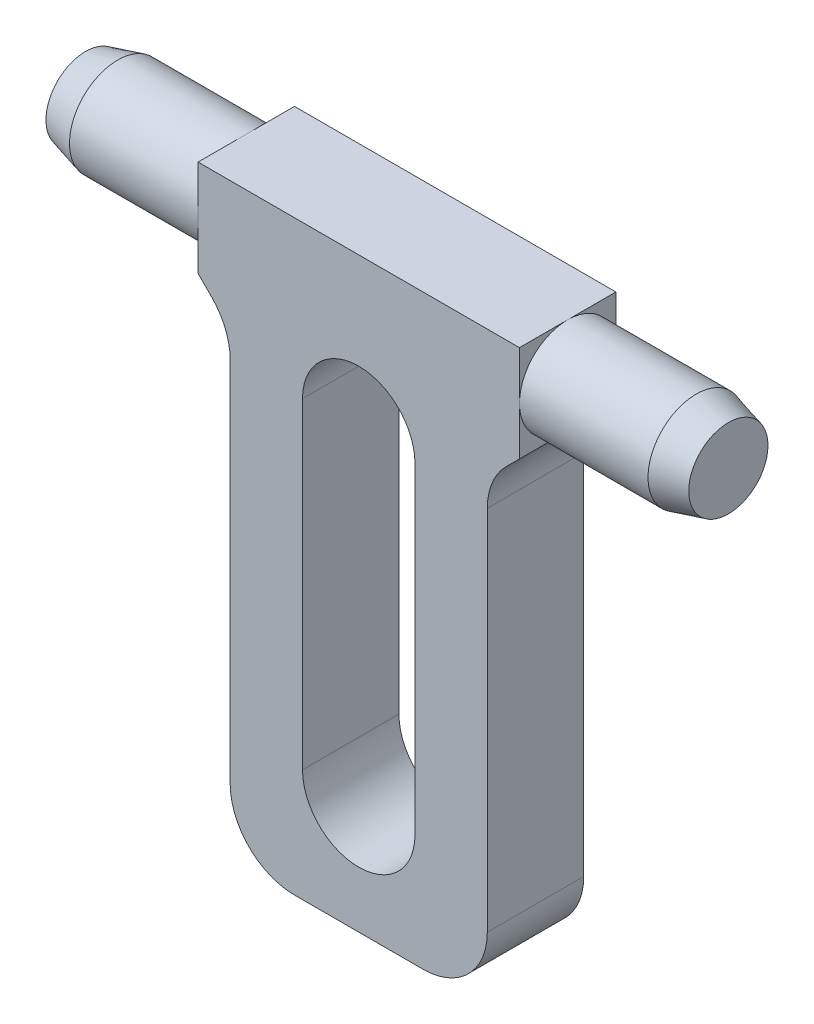
ISO-10303-21;
HEADER;
FILE_DESCRIPTION(('STEP AP214'),'2;1');
FILE_NAME('part.step','',(''),(''),'','','');
FILE_SCHEMA(('AUTOMOTIVE_DESIGN { 1 0 10303 214 1 1 1 1 }'));
ENDSEC;
DATA;
#1=APPLICATION_CONTEXT('core data for automotive mechanical design processes');
#2=APPLICATION_PROTOCOL_DEFINITION('international standard','automotive_design',2000,#1);
#3=PRODUCT_CONTEXT('',#1,'mechanical');
#4=PRODUCT('Part','Part','',(#3));
#5=PRODUCT_RELATED_PRODUCT_CATEGORY('part','',(#4));
#6=PRODUCT_DEFINITION_FORMATION('','',#4);
#7=PRODUCT_DEFINITION_CONTEXT('part definition',#1,'design');
#8=PRODUCT_DEFINITION('design','',#6,#7);
#9=PRODUCT_DEFINITION_SHAPE('','',#8);
#10=(LENGTH_UNIT() NAMED_UNIT(*) SI_UNIT(.MILLI.,.METRE.));
#11=(NAMED_UNIT(*) PLANE_ANGLE_UNIT() SI_UNIT($,.RADIAN.));
#12=(NAMED_UNIT(*) SI_UNIT($,.STERADIAN.) SOLID_ANGLE_UNIT());
#13=UNCERTAINTY_MEASURE_WITH_UNIT(LENGTH_MEASURE(1.E-05),#10,'distance_accuracy_value','');
#14=(GEOMETRIC_REPRESENTATION_CONTEXT(3) GLOBAL_UNCERTAINTY_ASSIGNED_CONTEXT((#13)) GLOBAL_UNIT_ASSIGNED_CONTEXT((#10,
#11,#12)) REPRESENTATION_CONTEXT('',''));
#15=CARTESIAN_POINT('',(0.,0.,0.));
#16=DIRECTION('',(0.,0.,1.));
#17=DIRECTION('',(1.,0.,0.));
#18=AXIS2_PLACEMENT_3D('',#15,#16,#17);
#19=CARTESIAN_POINT('',(5.,1.5,1.5));
#20=DIRECTION('',(-1.,0.,0.));
#21=DIRECTION('',(0.,0.,1.));
#22=AXIS2_PLACEMENT_3D('',#19,#20,#21);
#23=PLANE('',#22);
#24=CARTESIAN_POINT('',(5.,0.,0.));
#25=DIRECTION('',(-1.,0.,0.));
#26=DIRECTION('',(0.,0.,1.));
#27=AXIS2_PLACEMENT_3D('',#24,#25,#26);
#28=CIRCLE('',#27,1.5);
#29=CARTESIAN_POINT('',(5.,0.,1.5));
#30=VERTEX_POINT('',#29);
#31=CARTESIAN_POINT('',(5.,-1.5,0.));
#32=VERTEX_POINT('',#31);
#33=EDGE_CURVE('E342',#30,#32,#28,.F.);
#34=ORIENTED_EDGE('',*,*,#33,.F.);
#35=DIRECTION('',(0.,1.,0.));
#36=VECTOR('',#35,1.);
#37=CARTESIAN_POINT('',(5.,1.5,1.5));
#38=LINE('',#37,#36);
#39=CARTESIAN_POINT('',(5.,-1.5,1.5));
#40=VERTEX_POINT('',#39);
#41=EDGE_CURVE('E252',#40,#30,#38,.T.);
#42=ORIENTED_EDGE('',*,*,#41,.F.);
#43=DIRECTION('',(0.,0.,-1.));
#44=VECTOR('',#43,1.);
#45=CARTESIAN_POINT('',(5.,-1.5,1.5));
#46=LINE('',#45,#44);
#47=EDGE_CURVE('E11',#40,#32,#46,.T.);
#48=ORIENTED_EDGE('',*,*,#47,.T.);
#49=EDGE_LOOP('',(#34,#42,#48));
#50=FACE_BOUND('',#49,.T.);
#51=ADVANCED_FACE('F33',(#50),#23,.F.);
#52=CARTESIAN_POINT('',(5.,0.,-1.5));
#53=VERTEX_POINT('',#52);
#54=EDGE_CURVE('E51',#32,#53,#28,.F.);
#55=ORIENTED_EDGE('',*,*,#54,.F.);
#56=CARTESIAN_POINT('',(5.,-1.5,-1.5));
#57=VERTEX_POINT('',#56);
#58=EDGE_CURVE('E41',#32,#57,#46,.T.);
#59=ORIENTED_EDGE('',*,*,#58,.T.);
#60=DIRECTION('',(0.,1.,0.));
#61=VECTOR('',#60,1.);
#62=CARTESIAN_POINT('',(5.,1.5,-1.5));
#63=LINE('',#62,#61);
#64=EDGE_CURVE('E280',#57,#53,#63,.T.);
#65=ORIENTED_EDGE('',*,*,#64,.T.);
#66=EDGE_LOOP('',(#55,#59,#65));
#67=FACE_BOUND('',#66,.T.);
#68=ADVANCED_FACE('F336',(#67),#23,.F.);
#69=CARTESIAN_POINT('',(5.,1.5,0.));
#70=VERTEX_POINT('',#69);
#71=EDGE_CURVE('E200',#53,#70,#28,.F.);
#72=ORIENTED_EDGE('',*,*,#71,.F.);
#73=CARTESIAN_POINT('',(5.,1.5,-1.5));
#74=VERTEX_POINT('',#73);
#75=EDGE_CURVE('E279',#53,#74,#63,.T.);
#76=ORIENTED_EDGE('',*,*,#75,.T.);
#77=DIRECTION('',(0.,0.,-1.));
#78=VECTOR('',#77,1.);
#79=CARTESIAN_POINT('',(5.,1.5,1.5));
#80=LINE('',#79,#78);
#81=EDGE_CURVE('E324',#70,#74,#80,.T.);
#82=ORIENTED_EDGE('',*,*,#81,.F.);
#83=EDGE_LOOP('',(#72,#76,#82));
#84=FACE_BOUND('',#83,.T.);
#85=ADVANCED_FACE('F411',(#84),#23,.F.);
#86=EDGE_CURVE('E214',#70,#30,#28,.F.);
#87=ORIENTED_EDGE('',*,*,#86,.F.);
#88=CARTESIAN_POINT('',(5.,1.5,1.5));
#89=VERTEX_POINT('',#88);
#90=EDGE_CURVE('E325',#89,#70,#80,.T.);
#91=ORIENTED_EDGE('',*,*,#90,.F.);
#92=EDGE_CURVE('E250',#30,#89,#38,.T.);
#93=ORIENTED_EDGE('',*,*,#92,.F.);
#94=EDGE_LOOP('',(#87,#91,#93));
#95=FACE_BOUND('',#94,.T.);
#96=ADVANCED_FACE('F345',(#95),#23,.F.);
#97=CARTESIAN_POINT('',(-5.,1.5,1.5));
#98=DIRECTION('',(1.,0.,0.));
#99=DIRECTION('',(0.,0.,-1.));
#100=AXIS2_PLACEMENT_3D('',#97,#98,#99);
#101=PLANE('',#100);
#102=CARTESIAN_POINT('',(-5.,0.,0.));
#103=DIRECTION('',(1.,0.,0.));
#104=DIRECTION('',(0.,0.,-1.));
#105=AXIS2_PLACEMENT_3D('',#102,#103,#104);
#106=CIRCLE('',#105,1.5);
#107=CARTESIAN_POINT('',(-5.,0.,-1.5));
#108=VERTEX_POINT('',#107);
#109=CARTESIAN_POINT('',(-5.,-1.5,0.));
#110=VERTEX_POINT('',#109);
#111=EDGE_CURVE('E194',#108,#110,#106,.F.);
#112=ORIENTED_EDGE('',*,*,#111,.F.);
#113=DIRECTION('',(0.,-1.,0.));
#114=VECTOR('',#113,1.);
#115=CARTESIAN_POINT('',(-5.,1.5,-1.5));
#116=LINE('',#115,#114);
#117=CARTESIAN_POINT('',(-5.,-1.5,-1.5));
#118=VERTEX_POINT('',#117);
#119=EDGE_CURVE('E181',#108,#118,#116,.T.);
#120=ORIENTED_EDGE('',*,*,#119,.T.);
#121=DIRECTION('',(0.,0.,-1.));
#122=VECTOR('',#121,1.);
#123=CARTESIAN_POINT('',(-5.,-1.5,1.5));
#124=LINE('',#123,#122);
#125=EDGE_CURVE('E196',#110,#118,#124,.T.);
#126=ORIENTED_EDGE('',*,*,#125,.F.);
#127=EDGE_LOOP('',(#112,#120,#126));
#128=FACE_BOUND('',#127,.T.);
#129=ADVANCED_FACE('F195',(#128),#101,.F.);
#130=CARTESIAN_POINT('',(-5.,0.,1.5));
#131=VERTEX_POINT('',#130);
#132=EDGE_CURVE('E201',#110,#131,#106,.F.);
#133=ORIENTED_EDGE('',*,*,#132,.F.);
#134=CARTESIAN_POINT('',(-5.,-1.5,1.5));
#135=VERTEX_POINT('',#134);
#136=EDGE_CURVE('E320',#135,#110,#124,.T.);
#137=ORIENTED_EDGE('',*,*,#136,.F.);
#138=DIRECTION('',(0.,-1.,0.));
#139=VECTOR('',#138,1.);
#140=CARTESIAN_POINT('',(-5.,1.5,1.5));
#141=LINE('',#140,#139);
#142=EDGE_CURVE('E256',#131,#135,#141,.T.);
#143=ORIENTED_EDGE('',*,*,#142,.F.);
#144=EDGE_LOOP('',(#133,#137,#143));
#145=FACE_BOUND('',#144,.T.);
#146=ADVANCED_FACE('F392',(#145),#101,.F.);
#147=CARTESIAN_POINT('',(-5.,1.5,0.));
#148=VERTEX_POINT('',#147);
#149=EDGE_CURVE('E205',#131,#148,#106,.F.);
#150=ORIENTED_EDGE('',*,*,#149,.F.);
#151=CARTESIAN_POINT('',(-5.,1.5,1.5));
#152=VERTEX_POINT('',#151);
#153=EDGE_CURVE('E257',#152,#131,#141,.T.);
#154=ORIENTED_EDGE('',*,*,#153,.F.);
#155=DIRECTION('',(0.,0.,-1.));
#156=VECTOR('',#155,1.);
#157=CARTESIAN_POINT('',(-5.,1.5,1.5));
#158=LINE('',#157,#156);
#159=EDGE_CURVE('E322',#152,#148,#158,.T.);
#160=ORIENTED_EDGE('',*,*,#159,.T.);
#161=EDGE_LOOP('',(#150,#154,#160));
#162=FACE_BOUND('',#161,.T.);
#163=ADVANCED_FACE('F398',(#162),#101,.F.);
#164=EDGE_CURVE('E174',#148,#108,#106,.F.);
#165=ORIENTED_EDGE('',*,*,#164,.F.);
#166=CARTESIAN_POINT('',(-5.,1.5,-1.5));
#167=VERTEX_POINT('',#166);
#168=EDGE_CURVE('E176',#148,#167,#158,.T.);
#169=ORIENTED_EDGE('',*,*,#168,.T.);
#170=EDGE_CURVE('E170',#167,#108,#116,.T.);
#171=ORIENTED_EDGE('',*,*,#170,.T.);
#172=EDGE_LOOP('',(#165,#169,#171));
#173=FACE_BOUND('',#172,.T.);
#174=ADVANCED_FACE('F172',(#173),#101,.F.);
#175=CARTESIAN_POINT('',(-6.,-3.32842712474619,1.5));
#176=DIRECTION('',(0.,0.,-1.));
#177=DIRECTION('',(-1.,0.,0.));
#178=AXIS2_PLACEMENT_3D('',#175,#176,#177);
#179=PLANE('',#178);
#180=ORIENTED_EDGE('',*,*,#153,.T.);
#181=ORIENTED_EDGE('',*,*,#142,.T.);
#182=DIRECTION('',(0.707106781186547,-0.707106781186547,0.));
#183=VECTOR('',#182,1.);
#184=CARTESIAN_POINT('',(-5.,-1.5,1.5));
#185=LINE('',#184,#183);
#186=CARTESIAN_POINT('',(-4.58578643762691,-1.9142135623731,1.5));
#187=VERTEX_POINT('',#186);
#188=EDGE_CURVE('E260',#135,#187,#185,.T.);
#189=ORIENTED_EDGE('',*,*,#188,.T.);
#190=CARTESIAN_POINT('',(-6.,-3.32842712474619,1.5));
#191=DIRECTION('',(0.,0.,-1.));
#192=DIRECTION('',(-1.,0.,0.));
#193=AXIS2_PLACEMENT_3D('',#190,#191,#192);
#194=CIRCLE('',#193,2.);
#195=CARTESIAN_POINT('',(-4.,-3.32842712474619,1.5));
#196=VERTEX_POINT('',#195);
#197=EDGE_CURVE('E262',#187,#196,#194,.T.);
#198=ORIENTED_EDGE('',*,*,#197,.T.);
#199=DIRECTION('',(0.,-1.,0.));
#200=VECTOR('',#199,1.);
#201=CARTESIAN_POINT('',(-4.,-3.32842712474619,1.5));
#202=LINE('',#201,#200);
#203=CARTESIAN_POINT('',(-4.,-14.75,1.5));
#204=VERTEX_POINT('',#203);
#205=EDGE_CURVE('E264',#196,#204,#202,.T.);
#206=ORIENTED_EDGE('',*,*,#205,.T.);
#207=CARTESIAN_POINT('',(-2.,-14.75,1.5));
#208=DIRECTION('',(0.,0.,1.));
#209=DIRECTION('',(1.,0.,0.));
#210=AXIS2_PLACEMENT_3D('',#207,#208,#209);
#211=CIRCLE('',#210,2.);
#212=CARTESIAN_POINT('',(-2.,-16.75,1.5));
#213=VERTEX_POINT('',#212);
#214=EDGE_CURVE('E266',#204,#213,#211,.T.);
#215=ORIENTED_EDGE('',*,*,#214,.T.);
#216=DIRECTION('',(1.,0.,0.));
#217=VECTOR('',#216,1.);
#218=CARTESIAN_POINT('',(-2.,-16.75,1.5));
#219=LINE('',#218,#217);
#220=CARTESIAN_POINT('',(2.,-16.75,1.5));
#221=VERTEX_POINT('',#220);
#222=EDGE_CURVE('E268',#213,#221,#219,.T.);
#223=ORIENTED_EDGE('',*,*,#222,.T.);
#224=CARTESIAN_POINT('',(2.,-14.75,1.5));
#225=DIRECTION('',(0.,0.,1.));
#226=DIRECTION('',(1.,0.,0.));
#227=AXIS2_PLACEMENT_3D('',#224,#225,#226);
#228=CIRCLE('',#227,2.);
#229=CARTESIAN_POINT('',(4.,-14.75,1.5));
#230=VERTEX_POINT('',#229);
#231=EDGE_CURVE('E270',#221,#230,#228,.T.);
#232=ORIENTED_EDGE('',*,*,#231,.T.);
#233=DIRECTION('',(0.,1.,0.));
#234=VECTOR('',#233,1.);
#235=CARTESIAN_POINT('',(4.,-14.75,1.5));
#236=LINE('',#235,#234);
#237=CARTESIAN_POINT('',(4.,-3.32842712474619,1.5));
#238=VERTEX_POINT('',#237);
#239=EDGE_CURVE('E272',#230,#238,#236,.T.);
#240=ORIENTED_EDGE('',*,*,#239,.T.);
#241=CARTESIAN_POINT('',(6.,-3.32842712474619,1.5));
#242=DIRECTION('',(0.,0.,-1.));
#243=DIRECTION('',(-1.,0.,0.));
#244=AXIS2_PLACEMENT_3D('',#241,#242,#243);
#245=CIRCLE('',#244,2.);
#246=CARTESIAN_POINT('',(4.58578643762691,-1.9142135623731,1.5));
#247=VERTEX_POINT('',#246);
#248=EDGE_CURVE('E274',#238,#247,#245,.T.);
#249=ORIENTED_EDGE('',*,*,#248,.T.);
#250=DIRECTION('',(0.707106781186547,0.707106781186548,0.));
#251=VECTOR('',#250,1.);
#252=CARTESIAN_POINT('',(4.58578643762691,-1.9142135623731,1.5));
#253=LINE('',#252,#251);
#254=EDGE_CURVE('E247',#247,#40,#253,.T.);
#255=ORIENTED_EDGE('',*,*,#254,.T.);
#256=ORIENTED_EDGE('',*,*,#41,.T.);
#257=ORIENTED_EDGE('',*,*,#92,.T.);
#258=DIRECTION('',(-1.,0.,0.));
#259=VECTOR('',#258,1.);
#260=CARTESIAN_POINT('',(-5.,1.5,1.5));
#261=LINE('',#260,#259);
#262=EDGE_CURVE('E254',#89,#152,#261,.T.);
#263=ORIENTED_EDGE('',*,*,#262,.T.);
#264=EDGE_LOOP('',(#180,#181,#189,#198,#206,#215,#223,#232,#240,#249,#255,#256,#257,#263));
#265=FACE_BOUND('',#264,.T.);
#266=CARTESIAN_POINT('',(0.,-3.25,1.5));
#267=DIRECTION('',(0.,0.,1.));
#268=DIRECTION('',(1.,0.,0.));
#269=AXIS2_PLACEMENT_3D('',#266,#267,#268);
#270=CIRCLE('',#269,1.75);
#271=CARTESIAN_POINT('',(1.75,-3.25,1.5));
#272=VERTEX_POINT('',#271);
#273=CARTESIAN_POINT('',(-1.75,-3.25,1.5));
#274=VERTEX_POINT('',#273);
#275=EDGE_CURVE('E215',#272,#274,#270,.T.);
#276=ORIENTED_EDGE('',*,*,#275,.F.);
#277=DIRECTION('',(0.,1.,0.));
#278=VECTOR('',#277,1.);
#279=CARTESIAN_POINT('',(1.75,-3.25,1.5));
#280=LINE('',#279,#278);
#281=CARTESIAN_POINT('',(1.75,-13.25,1.5));
#282=VERTEX_POINT('',#281);
#283=EDGE_CURVE('E223',#282,#272,#280,.T.);
#284=ORIENTED_EDGE('',*,*,#283,.F.);
#285=CARTESIAN_POINT('',(0.,-13.25,1.5));
#286=DIRECTION('',(0.,0.,1.));
#287=DIRECTION('',(1.,0.,0.));
#288=AXIS2_PLACEMENT_3D('',#285,#286,#287);
#289=CIRCLE('',#288,1.75);
#290=CARTESIAN_POINT('',(-1.75,-13.25,1.5));
#291=VERTEX_POINT('',#290);
#292=EDGE_CURVE('E220',#291,#282,#289,.T.);
#293=ORIENTED_EDGE('',*,*,#292,.F.);
#294=DIRECTION('',(0.,-1.,0.));
#295=VECTOR('',#294,1.);
#296=CARTESIAN_POINT('',(-1.75,-3.25,1.5));
#297=LINE('',#296,#295);
#298=EDGE_CURVE('E217',#274,#291,#297,.T.);
#299=ORIENTED_EDGE('',*,*,#298,.F.);
#300=EDGE_LOOP('',(#276,#284,#293,#299));
#301=FACE_BOUND('',#300,.T.);
#302=ADVANCED_FACE('F394',(#265,#301),#179,.F.);
#303=CARTESIAN_POINT('',(-6.,-3.32842712474619,-1.5));
#304=DIRECTION('',(0.,0.,-1.));
#305=DIRECTION('',(-1.,0.,0.));
#306=AXIS2_PLACEMENT_3D('',#303,#304,#305);
#307=PLANE('',#306);
#308=ORIENTED_EDGE('',*,*,#75,.F.);
#309=ORIENTED_EDGE('',*,*,#64,.F.);
#310=DIRECTION('',(0.707106781186547,0.707106781186548,0.));
#311=VECTOR('',#310,1.);
#312=CARTESIAN_POINT('',(4.58578643762691,-1.9142135623731,-1.5));
#313=LINE('',#312,#311);
#314=CARTESIAN_POINT('',(4.58578643762691,-1.9142135623731,-1.5));
#315=VERTEX_POINT('',#314);
#316=EDGE_CURVE('E246',#315,#57,#313,.T.);
#317=ORIENTED_EDGE('',*,*,#316,.F.);
#318=CARTESIAN_POINT('',(6.,-3.32842712474619,-1.5));
#319=DIRECTION('',(0.,0.,-1.));
#320=DIRECTION('',(-1.,0.,0.));
#321=AXIS2_PLACEMENT_3D('',#318,#319,#320);
#322=CIRCLE('',#321,2.);
#323=CARTESIAN_POINT('',(4.,-3.32842712474619,-1.5));
#324=VERTEX_POINT('',#323);
#325=EDGE_CURVE('E251',#324,#315,#322,.T.);
#326=ORIENTED_EDGE('',*,*,#325,.F.);
#327=DIRECTION('',(0.,1.,0.));
#328=VECTOR('',#327,1.);
#329=CARTESIAN_POINT('',(4.,-14.75,-1.5));
#330=LINE('',#329,#328);
#331=CARTESIAN_POINT('',(4.,-14.75,-1.5));
#332=VERTEX_POINT('',#331);
#333=EDGE_CURVE('E294',#332,#324,#330,.T.);
#334=ORIENTED_EDGE('',*,*,#333,.F.);
#335=CARTESIAN_POINT('',(2.,-14.75,-1.5));
#336=DIRECTION('',(0.,0.,1.));
#337=DIRECTION('',(1.,0.,0.));
#338=AXIS2_PLACEMENT_3D('',#335,#336,#337);
#339=CIRCLE('',#338,2.);
#340=CARTESIAN_POINT('',(2.,-16.75,-1.5));
#341=VERTEX_POINT('',#340);
#342=EDGE_CURVE('E292',#341,#332,#339,.T.);
#343=ORIENTED_EDGE('',*,*,#342,.F.);
#344=DIRECTION('',(1.,0.,0.));
#345=VECTOR('',#344,1.);
#346=CARTESIAN_POINT('',(-2.,-16.75,-1.5));
#347=LINE('',#346,#345);
#348=CARTESIAN_POINT('',(-2.,-16.75,-1.5));
#349=VERTEX_POINT('',#348);
#350=EDGE_CURVE('E290',#349,#341,#347,.T.);
#351=ORIENTED_EDGE('',*,*,#350,.F.);
#352=CARTESIAN_POINT('',(-2.,-14.75,-1.5));
#353=DIRECTION('',(0.,0.,1.));
#354=DIRECTION('',(1.,0.,0.));
#355=AXIS2_PLACEMENT_3D('',#352,#353,#354);
#356=CIRCLE('',#355,2.);
#357=CARTESIAN_POINT('',(-4.,-14.75,-1.5));
#358=VERTEX_POINT('',#357);
#359=EDGE_CURVE('E288',#358,#349,#356,.T.);
#360=ORIENTED_EDGE('',*,*,#359,.F.);
#361=DIRECTION('',(0.,-1.,0.));
#362=VECTOR('',#361,1.);
#363=CARTESIAN_POINT('',(-4.,-3.32842712474619,-1.5));
#364=LINE('',#363,#362);
#365=CARTESIAN_POINT('',(-4.,-3.32842712474619,-1.5));
#366=VERTEX_POINT('',#365);
#367=EDGE_CURVE('E286',#366,#358,#364,.T.);
#368=ORIENTED_EDGE('',*,*,#367,.F.);
#369=CARTESIAN_POINT('',(-6.,-3.32842712474619,-1.5));
#370=DIRECTION('',(0.,0.,-1.));
#371=DIRECTION('',(-1.,0.,0.));
#372=AXIS2_PLACEMENT_3D('',#369,#370,#371);
#373=CIRCLE('',#372,2.);
#374=CARTESIAN_POINT('',(-4.58578643762691,-1.9142135623731,-1.5));
#375=VERTEX_POINT('',#374);
#376=EDGE_CURVE('E284',#375,#366,#373,.T.);
#377=ORIENTED_EDGE('',*,*,#376,.F.);
#378=DIRECTION('',(0.707106781186547,-0.707106781186547,0.));
#379=VECTOR('',#378,1.);
#380=CARTESIAN_POINT('',(-5.,-1.5,-1.5));
#381=LINE('',#380,#379);
#382=EDGE_CURVE('E180',#118,#375,#381,.T.);
#383=ORIENTED_EDGE('',*,*,#382,.F.);
#384=ORIENTED_EDGE('',*,*,#119,.F.);
#385=ORIENTED_EDGE('',*,*,#170,.F.);
#386=DIRECTION('',(-1.,0.,0.));
#387=VECTOR('',#386,1.);
#388=CARTESIAN_POINT('',(-5.,1.5,-1.5));
#389=LINE('',#388,#387);
#390=EDGE_CURVE('E192',#74,#167,#389,.T.);
#391=ORIENTED_EDGE('',*,*,#390,.F.);
#392=EDGE_LOOP('',(#308,#309,#317,#326,#334,#343,#351,#360,#368,#377,#383,#384,#385,#391));
#393=FACE_BOUND('',#392,.T.);
#394=DIRECTION('',(0.,1.,0.));
#395=VECTOR('',#394,1.);
#396=CARTESIAN_POINT('',(1.75,-3.25,-1.5));
#397=LINE('',#396,#395);
#398=CARTESIAN_POINT('',(1.75,-13.25,-1.5));
#399=VERTEX_POINT('',#398);
#400=CARTESIAN_POINT('',(1.75,-3.25,-1.5));
#401=VERTEX_POINT('',#400);
#402=EDGE_CURVE('E218',#399,#401,#397,.T.);
#403=ORIENTED_EDGE('',*,*,#402,.T.);
#404=CARTESIAN_POINT('',(0.,-3.25,-1.5));
#405=DIRECTION('',(0.,0.,1.));
#406=DIRECTION('',(1.,0.,0.));
#407=AXIS2_PLACEMENT_3D('',#404,#405,#406);
#408=CIRCLE('',#407,1.75);
#409=CARTESIAN_POINT('',(-1.75,-3.25,-1.5));
#410=VERTEX_POINT('',#409);
#411=EDGE_CURVE('E226',#401,#410,#408,.T.);
#412=ORIENTED_EDGE('',*,*,#411,.T.);
#413=DIRECTION('',(0.,-1.,0.));
#414=VECTOR('',#413,1.);
#415=CARTESIAN_POINT('',(-1.75,-3.25,-1.5));
#416=LINE('',#415,#414);
#417=CARTESIAN_POINT('',(-1.75,-13.25,-1.5));
#418=VERTEX_POINT('',#417);
#419=EDGE_CURVE('E229',#410,#418,#416,.T.);
#420=ORIENTED_EDGE('',*,*,#419,.T.);
#421=CARTESIAN_POINT('',(0.,-13.25,-1.5));
#422=DIRECTION('',(0.,0.,1.));
#423=DIRECTION('',(1.,0.,0.));
#424=AXIS2_PLACEMENT_3D('',#421,#422,#423);
#425=CIRCLE('',#424,1.75);
#426=EDGE_CURVE('E232',#418,#399,#425,.T.);
#427=ORIENTED_EDGE('',*,*,#426,.T.);
#428=EDGE_LOOP('',(#403,#412,#420,#427));
#429=FACE_BOUND('',#428,.T.);
#430=ADVANCED_FACE('F186',(#393,#429),#307,.T.);
#431=CARTESIAN_POINT('',(4.58578643762691,-1.9142135623731,1.5));
#432=DIRECTION('',(-0.707106781186548,0.707106781186547,0.));
#433=DIRECTION('',(-0.707106781186547,-0.707106781186548,0.));
#434=AXIS2_PLACEMENT_3D('',#431,#432,#433);
#435=PLANE('',#434);
#436=ORIENTED_EDGE('',*,*,#316,.T.);
#437=ORIENTED_EDGE('',*,*,#58,.F.);
#438=ORIENTED_EDGE('',*,*,#47,.F.);
#439=ORIENTED_EDGE('',*,*,#254,.F.);
#440=DIRECTION('',(0.,0.,-1.));
#441=VECTOR('',#440,1.);
#442=CARTESIAN_POINT('',(4.58578643762691,-1.9142135623731,1.5));
#443=LINE('',#442,#441);
#444=EDGE_CURVE('E276',#247,#315,#443,.T.);
#445=ORIENTED_EDGE('',*,*,#444,.T.);
#446=EDGE_LOOP('',(#436,#437,#438,#439,#445));
#447=FACE_BOUND('',#446,.T.);
#448=ADVANCED_FACE('F35',(#447),#435,.F.);
#449=CARTESIAN_POINT('',(-5.,1.5,1.5));
#450=DIRECTION('',(0.,-1.,0.));
#451=DIRECTION('',(0.,0.,-1.));
#452=AXIS2_PLACEMENT_3D('',#449,#450,#451);
#453=PLANE('',#452);
#454=ORIENTED_EDGE('',*,*,#168,.F.);
#455=ORIENTED_EDGE('',*,*,#159,.F.);
#456=ORIENTED_EDGE('',*,*,#262,.F.);
#457=ORIENTED_EDGE('',*,*,#90,.T.);
#458=ORIENTED_EDGE('',*,*,#81,.T.);
#459=ORIENTED_EDGE('',*,*,#390,.T.);
#460=EDGE_LOOP('',(#454,#455,#456,#457,#458,#459));
#461=FACE_BOUND('',#460,.T.);
#462=ADVANCED_FACE('F332',(#461),#453,.F.);
#463=CARTESIAN_POINT('',(-5.,-1.5,1.5));
#464=DIRECTION('',(0.707106781186548,0.707106781186548,0.));
#465=DIRECTION('',(-0.707106781186548,0.707106781186548,0.));
#466=AXIS2_PLACEMENT_3D('',#463,#464,#465);
#467=PLANE('',#466);
#468=ORIENTED_EDGE('',*,*,#382,.T.);
#469=DIRECTION('',(0.,0.,-1.));
#470=VECTOR('',#469,1.);
#471=CARTESIAN_POINT('',(-4.58578643762691,-1.9142135623731,1.5));
#472=LINE('',#471,#470);
#473=EDGE_CURVE('E317',#187,#375,#472,.T.);
#474=ORIENTED_EDGE('',*,*,#473,.F.);
#475=ORIENTED_EDGE('',*,*,#188,.F.);
#476=ORIENTED_EDGE('',*,*,#136,.T.);
#477=ORIENTED_EDGE('',*,*,#125,.T.);
#478=EDGE_LOOP('',(#468,#474,#475,#476,#477));
#479=FACE_BOUND('',#478,.T.);
#480=ADVANCED_FACE('F388',(#479),#467,.F.);
#481=CARTESIAN_POINT('',(-6.,-3.32842712474619,1.5));
#482=DIRECTION('',(0.,0.,-1.));
#483=DIRECTION('',(-1.,0.,0.));
#484=AXIS2_PLACEMENT_3D('',#481,#482,#483);
#485=CYLINDRICAL_SURFACE('',#484,2.);
#486=ORIENTED_EDGE('',*,*,#376,.T.);
#487=DIRECTION('',(0.,0.,-1.));
#488=VECTOR('',#487,1.);
#489=CARTESIAN_POINT('',(-4.,-3.32842712474619,1.5));
#490=LINE('',#489,#488);
#491=EDGE_CURVE('E314',#196,#366,#490,.T.);
#492=ORIENTED_EDGE('',*,*,#491,.F.);
#493=ORIENTED_EDGE('',*,*,#197,.F.);
#494=ORIENTED_EDGE('',*,*,#473,.T.);
#495=EDGE_LOOP('',(#486,#492,#493,#494));
#496=FACE_BOUND('',#495,.T.);
#497=ADVANCED_FACE('F383',(#496),#485,.F.);
#498=CARTESIAN_POINT('',(-4.,-3.32842712474619,1.5));
#499=DIRECTION('',(1.,0.,0.));
#500=DIRECTION('',(0.,0.,-1.));
#501=AXIS2_PLACEMENT_3D('',#498,#499,#500);
#502=PLANE('',#501);
#503=ORIENTED_EDGE('',*,*,#367,.T.);
#504=DIRECTION('',(0.,0.,-1.));
#505=VECTOR('',#504,1.);
#506=CARTESIAN_POINT('',(-4.,-14.75,1.5));
#507=LINE('',#506,#505);
#508=EDGE_CURVE('E311',#204,#358,#507,.T.);
#509=ORIENTED_EDGE('',*,*,#508,.F.);
#510=ORIENTED_EDGE('',*,*,#205,.F.);
#511=ORIENTED_EDGE('',*,*,#491,.T.);
#512=EDGE_LOOP('',(#503,#509,#510,#511));
#513=FACE_BOUND('',#512,.T.);
#514=ADVANCED_FACE('F380',(#513),#502,.F.);
#515=CARTESIAN_POINT('',(-2.,-14.75,1.5));
#516=DIRECTION('',(0.,0.,-1.));
#517=DIRECTION('',(-1.,0.,0.));
#518=AXIS2_PLACEMENT_3D('',#515,#516,#517);
#519=CYLINDRICAL_SURFACE('',#518,2.);
#520=ORIENTED_EDGE('',*,*,#359,.T.);
#521=DIRECTION('',(0.,0.,-1.));
#522=VECTOR('',#521,1.);
#523=CARTESIAN_POINT('',(-2.,-16.75,1.5));
#524=LINE('',#523,#522);
#525=EDGE_CURVE('E308',#213,#349,#524,.T.);
#526=ORIENTED_EDGE('',*,*,#525,.F.);
#527=ORIENTED_EDGE('',*,*,#214,.F.);
#528=ORIENTED_EDGE('',*,*,#508,.T.);
#529=EDGE_LOOP('',(#520,#526,#527,#528));
#530=FACE_BOUND('',#529,.T.);
#531=ADVANCED_FACE('F376',(#530),#519,.T.);
#532=CARTESIAN_POINT('',(-2.,-16.75,1.5));
#533=DIRECTION('',(0.,1.,0.));
#534=DIRECTION('',(0.,0.,1.));
#535=AXIS2_PLACEMENT_3D('',#532,#533,#534);
#536=PLANE('',#535);
#537=ORIENTED_EDGE('',*,*,#350,.T.);
#538=DIRECTION('',(0.,0.,-1.));
#539=VECTOR('',#538,1.);
#540=CARTESIAN_POINT('',(2.,-16.75,1.5));
#541=LINE('',#540,#539);
#542=EDGE_CURVE('E305',#221,#341,#541,.T.);
#543=ORIENTED_EDGE('',*,*,#542,.F.);
#544=ORIENTED_EDGE('',*,*,#222,.F.);
#545=ORIENTED_EDGE('',*,*,#525,.T.);
#546=EDGE_LOOP('',(#537,#543,#544,#545));
#547=FACE_BOUND('',#546,.T.);
#548=ADVANCED_FACE('F371',(#547),#536,.F.);
#549=CARTESIAN_POINT('',(2.,-14.75,1.5));
#550=DIRECTION('',(0.,0.,-1.));
#551=DIRECTION('',(-1.,0.,0.));
#552=AXIS2_PLACEMENT_3D('',#549,#550,#551);
#553=CYLINDRICAL_SURFACE('',#552,2.);
#554=ORIENTED_EDGE('',*,*,#342,.T.);
#555=DIRECTION('',(0.,0.,-1.));
#556=VECTOR('',#555,1.);
#557=CARTESIAN_POINT('',(4.,-14.75,1.5));
#558=LINE('',#557,#556);
#559=EDGE_CURVE('E302',#230,#332,#558,.T.);
#560=ORIENTED_EDGE('',*,*,#559,.F.);
#561=ORIENTED_EDGE('',*,*,#231,.F.);
#562=ORIENTED_EDGE('',*,*,#542,.T.);
#563=EDGE_LOOP('',(#554,#560,#561,#562));
#564=FACE_BOUND('',#563,.T.);
#565=ADVANCED_FACE('F365',(#564),#553,.T.);
#566=CARTESIAN_POINT('',(4.,-14.75,1.5));
#567=DIRECTION('',(-1.,0.,0.));
#568=DIRECTION('',(0.,0.,1.));
#569=AXIS2_PLACEMENT_3D('',#566,#567,#568);
#570=PLANE('',#569);
#571=ORIENTED_EDGE('',*,*,#333,.T.);
#572=DIRECTION('',(0.,0.,-1.));
#573=VECTOR('',#572,1.);
#574=CARTESIAN_POINT('',(4.,-3.32842712474619,1.5));
#575=LINE('',#574,#573);
#576=EDGE_CURVE('E299',#238,#324,#575,.T.);
#577=ORIENTED_EDGE('',*,*,#576,.F.);
#578=ORIENTED_EDGE('',*,*,#239,.F.);
#579=ORIENTED_EDGE('',*,*,#559,.T.);
#580=EDGE_LOOP('',(#571,#577,#578,#579));
#581=FACE_BOUND('',#580,.T.);
#582=ADVANCED_FACE('F361',(#581),#570,.F.);
#583=CARTESIAN_POINT('',(6.,-3.32842712474619,1.5));
#584=DIRECTION('',(0.,0.,-1.));
#585=DIRECTION('',(-1.,0.,0.));
#586=AXIS2_PLACEMENT_3D('',#583,#584,#585);
#587=CYLINDRICAL_SURFACE('',#586,2.);
#588=ORIENTED_EDGE('',*,*,#325,.T.);
#589=ORIENTED_EDGE('',*,*,#444,.F.);
#590=ORIENTED_EDGE('',*,*,#248,.F.);
#591=ORIENTED_EDGE('',*,*,#576,.T.);
#592=EDGE_LOOP('',(#588,#589,#590,#591));
#593=FACE_BOUND('',#592,.T.);
#594=ADVANCED_FACE('F356',(#593),#587,.F.);
#595=CARTESIAN_POINT('',(0.,-3.25,1.5));
#596=DIRECTION('',(0.,0.,-1.));
#597=DIRECTION('',(-1.,0.,0.));
#598=AXIS2_PLACEMENT_3D('',#595,#596,#597);
#599=CYLINDRICAL_SURFACE('',#598,1.75);
#600=CARTESIAN_POINT('',(0.,-1.5,0.));
#601=VERTEX_POINT('',#600);
#602=VERTEX_LOOP('',#601);
#603=FACE_BOUND('',#602,.T.);
#604=ORIENTED_EDGE('',*,*,#411,.F.);
#605=DIRECTION('',(0.,0.,-1.));
#606=VECTOR('',#605,1.);
#607=CARTESIAN_POINT('',(1.75,-3.25,1.5));
#608=LINE('',#607,#606);
#609=EDGE_CURVE('E225',#272,#401,#608,.T.);
#610=ORIENTED_EDGE('',*,*,#609,.F.);
#611=ORIENTED_EDGE('',*,*,#275,.T.);
#612=DIRECTION('',(0.,0.,-1.));
#613=VECTOR('',#612,1.);
#614=CARTESIAN_POINT('',(-1.75,-3.25,1.5));
#615=LINE('',#614,#613);
#616=EDGE_CURVE('E243',#274,#410,#615,.T.);
#617=ORIENTED_EDGE('',*,*,#616,.T.);
#618=EDGE_LOOP('',(#604,#610,#611,#617));
#619=FACE_BOUND('',#618,.T.);
#620=ADVANCED_FACE('F460',(#603,#619),#599,.F.);
#621=CARTESIAN_POINT('',(-1.75,-3.25,1.5));
#622=DIRECTION('',(1.,0.,0.));
#623=DIRECTION('',(0.,1.,0.));
#624=AXIS2_PLACEMENT_3D('',#621,#622,#623);
#625=PLANE('',#624);
#626=ORIENTED_EDGE('',*,*,#419,.F.);
#627=ORIENTED_EDGE('',*,*,#616,.F.);
#628=ORIENTED_EDGE('',*,*,#298,.T.);
#629=DIRECTION('',(0.,0.,-1.));
#630=VECTOR('',#629,1.);
#631=CARTESIAN_POINT('',(-1.75,-13.25,1.5));
#632=LINE('',#631,#630);
#633=EDGE_CURVE('E241',#291,#418,#632,.T.);
#634=ORIENTED_EDGE('',*,*,#633,.T.);
#635=EDGE_LOOP('',(#626,#627,#628,#634));
#636=FACE_BOUND('',#635,.T.);
#637=ADVANCED_FACE('F450',(#636),#625,.T.);
#638=CARTESIAN_POINT('',(0.,-13.25,1.5));
#639=DIRECTION('',(0.,0.,-1.));
#640=DIRECTION('',(-1.,0.,0.));
#641=AXIS2_PLACEMENT_3D('',#638,#639,#640);
#642=CYLINDRICAL_SURFACE('',#641,1.75);
#643=ORIENTED_EDGE('',*,*,#426,.F.);
#644=ORIENTED_EDGE('',*,*,#633,.F.);
#645=ORIENTED_EDGE('',*,*,#292,.T.);
#646=DIRECTION('',(0.,0.,-1.));
#647=VECTOR('',#646,1.);
#648=CARTESIAN_POINT('',(1.75,-13.25,1.5));
#649=LINE('',#648,#647);
#650=EDGE_CURVE('E239',#282,#399,#649,.T.);
#651=ORIENTED_EDGE('',*,*,#650,.T.);
#652=EDGE_LOOP('',(#643,#644,#645,#651));
#653=FACE_BOUND('',#652,.T.);
#654=ADVANCED_FACE('F438',(#653),#642,.F.);
#655=CARTESIAN_POINT('',(1.75,-3.25,1.5));
#656=DIRECTION('',(-1.,0.,0.));
#657=DIRECTION('',(0.,-1.,0.));
#658=AXIS2_PLACEMENT_3D('',#655,#656,#657);
#659=PLANE('',#658);
#660=ORIENTED_EDGE('',*,*,#402,.F.);
#661=ORIENTED_EDGE('',*,*,#650,.F.);
#662=ORIENTED_EDGE('',*,*,#283,.T.);
#663=ORIENTED_EDGE('',*,*,#609,.T.);
#664=EDGE_LOOP('',(#660,#661,#662,#663));
#665=FACE_BOUND('',#664,.T.);
#666=ADVANCED_FACE('F433',(#665),#659,.T.);
#667=CARTESIAN_POINT('',(10.,0.,0.));
#668=DIRECTION('',(-1.,0.,0.));
#669=DIRECTION('',(0.,0.,1.));
#670=AXIS2_PLACEMENT_3D('',#667,#668,#669);
#671=CYLINDRICAL_SURFACE('',#670,1.5);
#672=CARTESIAN_POINT('',(-9.,0.,0.));
#673=DIRECTION('',(1.,0.,0.));
#674=DIRECTION('',(0.,0.,-1.));
#675=AXIS2_PLACEMENT_3D('',#672,#673,#674);
#676=CIRCLE('',#675,1.5);
#677=CARTESIAN_POINT('',(-9.,0.,-1.5));
#678=VERTEX_POINT('',#677);
#679=EDGE_CURVE('E206',#678,#678,#676,.T.);
#680=ORIENTED_EDGE('',*,*,#679,.T.);
#681=EDGE_LOOP('',(#680));
#682=FACE_BOUND('',#681,.T.);
#683=ORIENTED_EDGE('',*,*,#164,.T.);
#684=ORIENTED_EDGE('',*,*,#111,.T.);
#685=ORIENTED_EDGE('',*,*,#132,.T.);
#686=ORIENTED_EDGE('',*,*,#149,.T.);
#687=EDGE_LOOP('',(#683,#684,#685,#686));
#688=FACE_BOUND('',#687,.T.);
#689=ADVANCED_FACE('F204',(#682,#688),#671,.T.);
#690=CARTESIAN_POINT('',(9.,0.,0.));
#691=DIRECTION('',(1.,0.,0.));
#692=DIRECTION('',(0.,0.,-1.));
#693=AXIS2_PLACEMENT_3D('',#690,#691,#692);
#694=CIRCLE('',#693,1.5);
#695=CARTESIAN_POINT('',(9.,0.,-1.5));
#696=VERTEX_POINT('',#695);
#697=EDGE_CURVE('E616',#696,#696,#694,.T.);
#698=ORIENTED_EDGE('',*,*,#697,.F.);
#699=EDGE_LOOP('',(#698));
#700=FACE_BOUND('',#699,.T.);
#701=ORIENTED_EDGE('',*,*,#33,.T.);
#702=ORIENTED_EDGE('',*,*,#54,.T.);
#703=ORIENTED_EDGE('',*,*,#71,.T.);
#704=ORIENTED_EDGE('',*,*,#86,.T.);
#705=EDGE_LOOP('',(#701,#702,#703,#704));
#706=FACE_BOUND('',#705,.T.);
#707=ADVANCED_FACE('F339',(#700,#706),#671,.T.);
#708=CARTESIAN_POINT('',(-10.,0.,0.));
#709=DIRECTION('',(1.,0.,0.));
#710=DIRECTION('',(0.,0.,-1.));
#711=AXIS2_PLACEMENT_3D('',#708,#709,#710);
#712=CONICAL_SURFACE('',#711,1.23205080756888,0.261799387799144);
#713=ORIENTED_EDGE('',*,*,#679,.F.);
#714=EDGE_LOOP('',(#713));
#715=FACE_BOUND('',#714,.T.);
#716=CARTESIAN_POINT('',(-10.,0.,0.));
#717=DIRECTION('',(1.,0.,0.));
#718=DIRECTION('',(0.,0.,-1.));
#719=AXIS2_PLACEMENT_3D('',#716,#717,#718);
#720=CIRCLE('',#719,1.23205080756888);
#721=CARTESIAN_POINT('',(-10.,0.,-1.23205080756888));
#722=VERTEX_POINT('',#721);
#723=EDGE_CURVE('E208',#722,#722,#720,.T.);
#724=ORIENTED_EDGE('',*,*,#723,.T.);
#725=EDGE_LOOP('',(#724));
#726=FACE_BOUND('',#725,.T.);
#727=ADVANCED_FACE('F592',(#715,#726),#712,.T.);
#728=CARTESIAN_POINT('',(-10.,0.,0.));
#729=DIRECTION('',(1.,0.,0.));
#730=DIRECTION('',(0.,0.,-1.));
#731=AXIS2_PLACEMENT_3D('',#728,#729,#730);
#732=PLANE('',#731);
#733=ORIENTED_EDGE('',*,*,#723,.F.);
#734=EDGE_LOOP('',(#733));
#735=FACE_BOUND('',#734,.T.);
#736=ADVANCED_FACE('F594',(#735),#732,.F.);
#737=CARTESIAN_POINT('',(9.,0.,0.));
#738=DIRECTION('',(-1.,0.,0.));
#739=DIRECTION('',(0.,0.,1.));
#740=AXIS2_PLACEMENT_3D('',#737,#738,#739);
#741=CONICAL_SURFACE('',#740,1.5,0.261799387799143);
#742=CARTESIAN_POINT('',(10.,0.,0.));
#743=DIRECTION('',(1.,0.,0.));
#744=DIRECTION('',(0.,0.,-1.));
#745=AXIS2_PLACEMENT_3D('',#742,#743,#744);
#746=CIRCLE('',#745,1.23205080756888);
#747=CARTESIAN_POINT('',(10.,0.,-1.23205080756888));
#748=VERTEX_POINT('',#747);
#749=EDGE_CURVE('E613',#748,#748,#746,.T.);
#750=ORIENTED_EDGE('',*,*,#749,.F.);
#751=EDGE_LOOP('',(#750));
#752=FACE_BOUND('',#751,.T.);
#753=ORIENTED_EDGE('',*,*,#697,.T.);
#754=EDGE_LOOP('',(#753));
#755=FACE_BOUND('',#754,.T.);
#756=ADVANCED_FACE('F597',(#752,#755),#741,.T.);
#757=CARTESIAN_POINT('',(10.,0.,0.));
#758=DIRECTION('',(1.,0.,0.));
#759=DIRECTION('',(0.,0.,-1.));
#760=AXIS2_PLACEMENT_3D('',#757,#758,#759);
#761=PLANE('',#760);
#762=ORIENTED_EDGE('',*,*,#749,.T.);
#763=EDGE_LOOP('',(#762));
#764=FACE_BOUND('',#763,.T.);
#765=ADVANCED_FACE('F599',(#764),#761,.T.);
#766=CLOSED_SHELL('',(#51,#68,#85,#96,#129,#146,#163,#174,#302,#430,#448,#462,#480,#497,#514,
#531,#548,#565,#582,#594,#620,#637,#654,#666,#689,#707,#727,#736,#756,#765));
#767=MANIFOLD_SOLID_BREP('B2',#766);
#768=ADVANCED_BREP_SHAPE_REPRESENTATION('',(#18,#767),#14);
#769=SHAPE_DEFINITION_REPRESENTATION(#9,#768);
ENDSEC;
END-ISO-10303-21;
